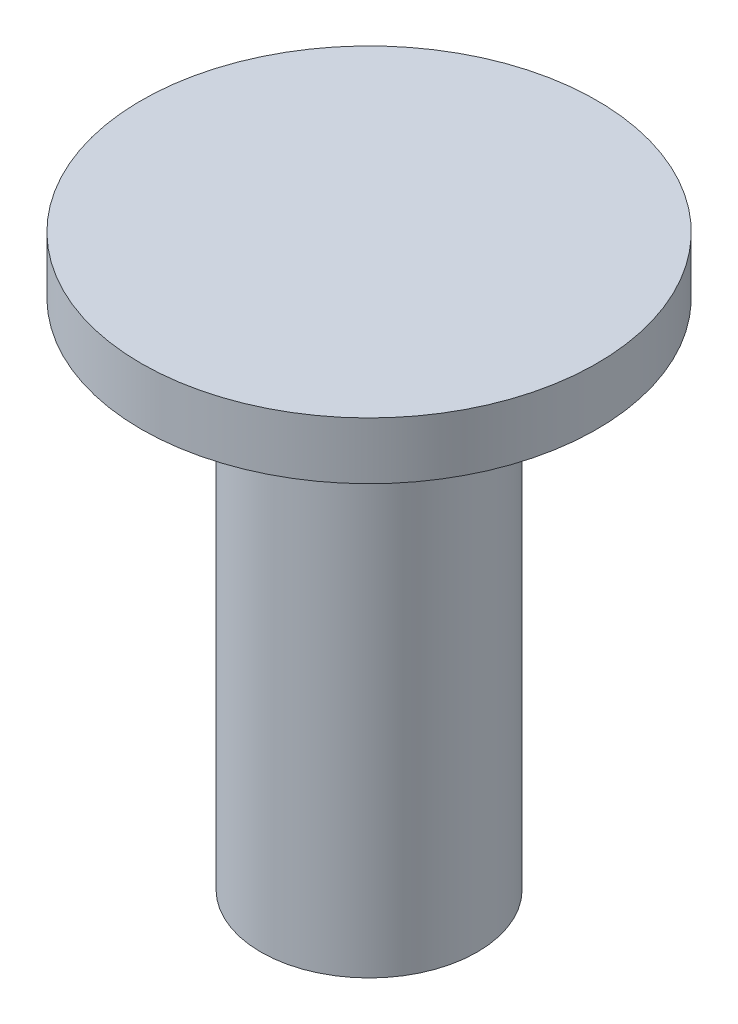
ISO-10303-21;
HEADER;
FILE_DESCRIPTION(('STEP AP214'),'2;1');
FILE_NAME('part.step','',(''),(''),'','','');
FILE_SCHEMA(('AUTOMOTIVE_DESIGN { 1 0 10303 214 1 1 1 1 }'));
ENDSEC;
DATA;
#1=APPLICATION_CONTEXT('core data for automotive mechanical design processes');
#2=APPLICATION_PROTOCOL_DEFINITION('international standard','automotive_design',2000,#1);
#3=PRODUCT_CONTEXT('',#1,'mechanical');
#4=PRODUCT('Part','Part','',(#3));
#5=PRODUCT_RELATED_PRODUCT_CATEGORY('part','',(#4));
#6=PRODUCT_DEFINITION_FORMATION('','',#4);
#7=PRODUCT_DEFINITION_CONTEXT('part definition',#1,'design');
#8=PRODUCT_DEFINITION('design','',#6,#7);
#9=PRODUCT_DEFINITION_SHAPE('','',#8);
#10=(LENGTH_UNIT() NAMED_UNIT(*) SI_UNIT(.MILLI.,.METRE.));
#11=(NAMED_UNIT(*) PLANE_ANGLE_UNIT() SI_UNIT($,.RADIAN.));
#12=(NAMED_UNIT(*) SI_UNIT($,.STERADIAN.) SOLID_ANGLE_UNIT());
#13=UNCERTAINTY_MEASURE_WITH_UNIT(LENGTH_MEASURE(1.E-05),#10,'distance_accuracy_value','');
#14=(GEOMETRIC_REPRESENTATION_CONTEXT(3) GLOBAL_UNCERTAINTY_ASSIGNED_CONTEXT((#13)) GLOBAL_UNIT_ASSIGNED_CONTEXT((#10,
#11,#12)) REPRESENTATION_CONTEXT('',''));
#15=CARTESIAN_POINT('',(0.,0.,0.));
#16=DIRECTION('',(0.,0.,1.));
#17=DIRECTION('',(1.,0.,0.));
#18=AXIS2_PLACEMENT_3D('',#15,#16,#17);
#19=CARTESIAN_POINT('',(0.,5.,0.));
#20=DIRECTION('',(0.,-1.,0.));
#21=DIRECTION('',(0.,0.,-1.));
#22=AXIS2_PLACEMENT_3D('',#19,#20,#21);
#23=CYLINDRICAL_SURFACE('',#22,0.95);
#24=CARTESIAN_POINT('',(0.,0.,0.));
#25=DIRECTION('',(0.,1.,0.));
#26=DIRECTION('',(0.,0.,1.));
#27=AXIS2_PLACEMENT_3D('',#24,#25,#26);
#28=CIRCLE('',#27,0.95);
#29=CARTESIAN_POINT('',(0.,0.,0.95));
#30=VERTEX_POINT('',#29);
#31=EDGE_CURVE('E37',#30,#30,#28,.T.);
#32=ORIENTED_EDGE('',*,*,#31,.T.);
#33=EDGE_LOOP('',(#32));
#34=FACE_BOUND('',#33,.T.);
#35=CARTESIAN_POINT('',(0.,4.5,0.));
#36=DIRECTION('',(0.,1.,0.));
#37=DIRECTION('',(0.,0.,1.));
#38=AXIS2_PLACEMENT_3D('',#35,#36,#37);
#39=CIRCLE('',#38,0.95);
#40=CARTESIAN_POINT('',(0.,4.5,0.95));
#41=VERTEX_POINT('',#40);
#42=EDGE_CURVE('E10',#41,#41,#39,.T.);
#43=ORIENTED_EDGE('',*,*,#42,.F.);
#44=EDGE_LOOP('',(#43));
#45=FACE_BOUND('',#44,.T.);
#46=ADVANCED_FACE('F31',(#34,#45),#23,.T.);
#47=CARTESIAN_POINT('',(0.,0.,0.));
#48=DIRECTION('',(0.,1.,0.));
#49=DIRECTION('',(0.,0.,1.));
#50=AXIS2_PLACEMENT_3D('',#47,#48,#49);
#51=PLANE('',#50);
#52=ORIENTED_EDGE('',*,*,#31,.F.);
#53=EDGE_LOOP('',(#52));
#54=FACE_BOUND('',#53,.T.);
#55=ADVANCED_FACE('F56',(#54),#51,.F.);
#56=CARTESIAN_POINT('',(0.,4.5,0.));
#57=DIRECTION('',(0.,1.,0.));
#58=DIRECTION('',(0.,0.,1.));
#59=AXIS2_PLACEMENT_3D('',#56,#57,#58);
#60=CYLINDRICAL_SURFACE('',#59,2.);
#61=CARTESIAN_POINT('',(0.,4.5,0.));
#62=DIRECTION('',(0.,1.,0.));
#63=DIRECTION('',(0.,0.,1.));
#64=AXIS2_PLACEMENT_3D('',#61,#62,#63);
#65=CIRCLE('',#64,2.);
#66=CARTESIAN_POINT('',(0.,4.5,2.));
#67=VERTEX_POINT('',#66);
#68=EDGE_CURVE('E41',#67,#67,#65,.T.);
#69=ORIENTED_EDGE('',*,*,#68,.T.);
#70=EDGE_LOOP('',(#69));
#71=FACE_BOUND('',#70,.T.);
#72=CARTESIAN_POINT('',(0.,5.,0.));
#73=DIRECTION('',(0.,1.,0.));
#74=DIRECTION('',(0.,0.,1.));
#75=AXIS2_PLACEMENT_3D('',#72,#73,#74);
#76=CIRCLE('',#75,2.);
#77=CARTESIAN_POINT('',(0.,5.,2.));
#78=VERTEX_POINT('',#77);
#79=EDGE_CURVE('E45',#78,#78,#76,.T.);
#80=ORIENTED_EDGE('',*,*,#79,.F.);
#81=EDGE_LOOP('',(#80));
#82=FACE_BOUND('',#81,.T.);
#83=ADVANCED_FACE('F53',(#71,#82),#60,.T.);
#84=CARTESIAN_POINT('',(0.,4.5,0.));
#85=DIRECTION('',(0.,1.,0.));
#86=DIRECTION('',(0.,0.,1.));
#87=AXIS2_PLACEMENT_3D('',#84,#85,#86);
#88=PLANE('',#87);
#89=ORIENTED_EDGE('',*,*,#42,.T.);
#90=EDGE_LOOP('',(#89));
#91=FACE_BOUND('',#90,.T.);
#92=ORIENTED_EDGE('',*,*,#68,.F.);
#93=EDGE_LOOP('',(#92));
#94=FACE_BOUND('',#93,.T.);
#95=ADVANCED_FACE('F55',(#91,#94),#88,.F.);
#96=CARTESIAN_POINT('',(0.,5.,0.));
#97=DIRECTION('',(0.,1.,0.));
#98=DIRECTION('',(0.,0.,1.));
#99=AXIS2_PLACEMENT_3D('',#96,#97,#98);
#100=PLANE('',#99);
#101=ORIENTED_EDGE('',*,*,#79,.T.);
#102=EDGE_LOOP('',(#101));
#103=FACE_BOUND('',#102,.T.);
#104=ADVANCED_FACE('F51',(#103),#100,.T.);
#105=CLOSED_SHELL('',(#46,#55,#83,#95,#104));
#106=MANIFOLD_SOLID_BREP('B2',#105);
#107=ADVANCED_BREP_SHAPE_REPRESENTATION('',(#18,#106),#14);
#108=SHAPE_DEFINITION_REPRESENTATION(#9,#107);
ENDSEC;
END-ISO-10303-21;
